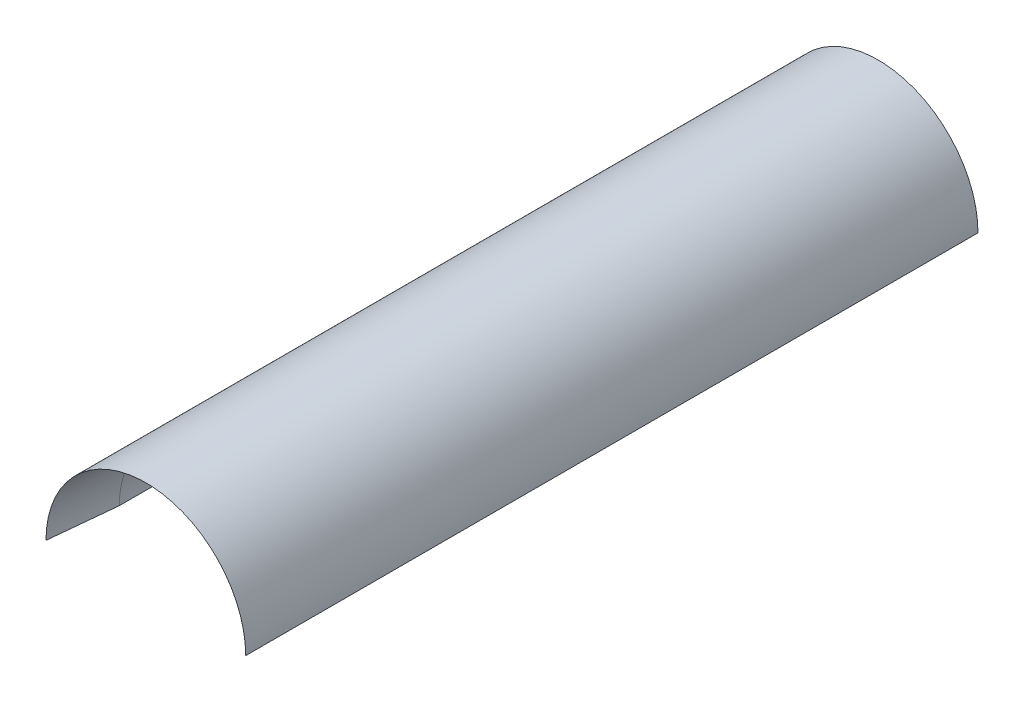
ISO-10303-21;
HEADER;
FILE_DESCRIPTION(('STEP AP214'),'2;1');
FILE_NAME('part.step','',(''),(''),'','','');
FILE_SCHEMA(('AUTOMOTIVE_DESIGN { 1 0 10303 214 1 1 1 1 }'));
ENDSEC;
DATA;
#1=APPLICATION_CONTEXT('core data for automotive mechanical design processes');
#2=APPLICATION_PROTOCOL_DEFINITION('international standard','automotive_design',2000,#1);
#3=PRODUCT_CONTEXT('',#1,'mechanical');
#4=PRODUCT('Part','Part','',(#3));
#5=PRODUCT_RELATED_PRODUCT_CATEGORY('part','',(#4));
#6=PRODUCT_DEFINITION_FORMATION('','',#4);
#7=PRODUCT_DEFINITION_CONTEXT('part definition',#1,'design');
#8=PRODUCT_DEFINITION('design','',#6,#7);
#9=PRODUCT_DEFINITION_SHAPE('','',#8);
#10=(LENGTH_UNIT() NAMED_UNIT(*) SI_UNIT(.MILLI.,.METRE.));
#11=(NAMED_UNIT(*) PLANE_ANGLE_UNIT() SI_UNIT($,.RADIAN.));
#12=(NAMED_UNIT(*) SI_UNIT($,.STERADIAN.) SOLID_ANGLE_UNIT());
#13=UNCERTAINTY_MEASURE_WITH_UNIT(LENGTH_MEASURE(1.E-05),#10,'distance_accuracy_value','');
#14=(GEOMETRIC_REPRESENTATION_CONTEXT(3) GLOBAL_UNCERTAINTY_ASSIGNED_CONTEXT((#13)) GLOBAL_UNIT_ASSIGNED_CONTEXT((#10,
#11,#12)) REPRESENTATION_CONTEXT('',''));
#15=CARTESIAN_POINT('',(0.,0.,0.));
#16=DIRECTION('',(0.,0.,1.));
#17=DIRECTION('',(1.,0.,0.));
#18=AXIS2_PLACEMENT_3D('',#15,#16,#17);
#19=CARTESIAN_POINT('',(0.,0.,220.));
#20=DIRECTION('',(0.,0.,-1.));
#21=DIRECTION('',(-1.,0.,0.));
#22=AXIS2_PLACEMENT_3D('',#19,#20,#21);
#23=CYLINDRICAL_SURFACE('',#22,28.);
#24=DIRECTION('',(0.,0.,-1.));
#25=VECTOR('',#24,1.);
#26=CARTESIAN_POINT('',(28.,0.,220.));
#27=LINE('',#26,#25);
#28=CARTESIAN_POINT('',(28.,0.,199.999999999999));
#29=VERTEX_POINT('',#28);
#30=CARTESIAN_POINT('',(28.,0.,0.));
#31=VERTEX_POINT('',#30);
#32=EDGE_CURVE('E78',#29,#31,#27,.T.);
#33=ORIENTED_EDGE('',*,*,#32,.F.);
#34=CARTESIAN_POINT('',(0.,0.,199.999999999999));
#35=DIRECTION('',(0.,0.,1.));
#36=DIRECTION('',(1.,0.,0.));
#37=AXIS2_PLACEMENT_3D('',#34,#35,#36);
#38=CIRCLE('',#37,28.);
#39=CARTESIAN_POINT('',(-28.,0.,199.999999999999));
#40=VERTEX_POINT('',#39);
#41=EDGE_CURVE('E88',#29,#40,#38,.T.);
#42=ORIENTED_EDGE('',*,*,#41,.T.);
#43=DIRECTION('',(0.,0.,-1.));
#44=VECTOR('',#43,1.);
#45=CARTESIAN_POINT('',(-28.,0.,220.));
#46=LINE('',#45,#44);
#47=CARTESIAN_POINT('',(-28.,0.,0.));
#48=VERTEX_POINT('',#47);
#49=EDGE_CURVE('E85',#40,#48,#46,.T.);
#50=ORIENTED_EDGE('',*,*,#49,.T.);
#51=CARTESIAN_POINT('',(0.,0.,0.));
#52=DIRECTION('',(0.,0.,1.));
#53=DIRECTION('',(1.,0.,0.));
#54=AXIS2_PLACEMENT_3D('',#51,#52,#53);
#55=CIRCLE('',#54,28.);
#56=EDGE_CURVE('E101',#31,#48,#55,.T.);
#57=ORIENTED_EDGE('',*,*,#56,.F.);
#58=EDGE_LOOP('',(#33,#42,#50,#57));
#59=FACE_BOUND('',#58,.T.);
#60=ADVANCED_FACE('F34',(#59),#23,.F.);
#61=CARTESIAN_POINT('',(0.,0.,220.));
#62=DIRECTION('',(0.,-1.,0.));
#63=DIRECTION('',(1.,0.,0.));
#64=AXIS2_PLACEMENT_3D('',#61,#62,#63);
#65=PLANE('',#64);
#66=DIRECTION('',(0.,0.,-1.));
#67=VECTOR('',#66,1.);
#68=CARTESIAN_POINT('',(30.,0.,220.));
#69=LINE('',#68,#67);
#70=CARTESIAN_POINT('',(30.,0.,220.));
#71=VERTEX_POINT('',#70);
#72=CARTESIAN_POINT('',(30.,0.,0.));
#73=VERTEX_POINT('',#72);
#74=EDGE_CURVE('E71',#71,#73,#69,.T.);
#75=ORIENTED_EDGE('',*,*,#74,.F.);
#76=DIRECTION('',(0.0995037190209955,0.,0.995037190209989));
#77=VECTOR('',#76,1.);
#78=CARTESIAN_POINT('',(0.,0.,-80.000000000011));
#79=LINE('',#78,#77);
#80=EDGE_CURVE('E11',#71,#29,#79,.F.);
#81=ORIENTED_EDGE('',*,*,#80,.T.);
#82=ORIENTED_EDGE('',*,*,#32,.T.);
#83=DIRECTION('',(-1.,0.,0.));
#84=VECTOR('',#83,1.);
#85=CARTESIAN_POINT('',(0.,0.,0.));
#86=LINE('',#85,#84);
#87=EDGE_CURVE('E75',#73,#31,#86,.T.);
#88=ORIENTED_EDGE('',*,*,#87,.F.);
#89=EDGE_LOOP('',(#75,#81,#82,#88));
#90=FACE_BOUND('',#89,.T.);
#91=ADVANCED_FACE('F73',(#90),#65,.T.);
#92=CARTESIAN_POINT('',(0.,0.,220.));
#93=DIRECTION('',(0.,0.,-1.));
#94=DIRECTION('',(-1.,0.,0.));
#95=AXIS2_PLACEMENT_3D('',#92,#93,#94);
#96=CYLINDRICAL_SURFACE('',#95,30.);
#97=CARTESIAN_POINT('',(0.,0.,0.));
#98=DIRECTION('',(0.,0.,1.));
#99=DIRECTION('',(1.,0.,0.));
#100=AXIS2_PLACEMENT_3D('',#97,#98,#99);
#101=CIRCLE('',#100,30.);
#102=CARTESIAN_POINT('',(-30.,0.,0.));
#103=VERTEX_POINT('',#102);
#104=EDGE_CURVE('E98',#73,#103,#101,.T.);
#105=ORIENTED_EDGE('',*,*,#104,.T.);
#106=DIRECTION('',(0.,0.,-1.));
#107=VECTOR('',#106,1.);
#108=CARTESIAN_POINT('',(-30.,0.,220.));
#109=LINE('',#108,#107);
#110=CARTESIAN_POINT('',(-30.,0.,220.));
#111=VERTEX_POINT('',#110);
#112=EDGE_CURVE('E79',#111,#103,#109,.T.);
#113=ORIENTED_EDGE('',*,*,#112,.F.);
#114=CARTESIAN_POINT('',(0.,0.,220.));
#115=DIRECTION('',(0.,0.,1.));
#116=DIRECTION('',(1.,0.,0.));
#117=AXIS2_PLACEMENT_3D('',#114,#115,#116);
#118=CIRCLE('',#117,30.);
#119=EDGE_CURVE('E82',#71,#111,#118,.T.);
#120=ORIENTED_EDGE('',*,*,#119,.F.);
#121=ORIENTED_EDGE('',*,*,#74,.T.);
#122=EDGE_LOOP('',(#105,#113,#120,#121));
#123=FACE_BOUND('',#122,.T.);
#124=ADVANCED_FACE('F83',(#123),#96,.T.);
#125=CARTESIAN_POINT('',(0.,0.,220.));
#126=DIRECTION('',(0.,1.,0.));
#127=DIRECTION('',(0.,0.,1.));
#128=AXIS2_PLACEMENT_3D('',#125,#126,#127);
#129=PLANE('',#128);
#130=ORIENTED_EDGE('',*,*,#49,.F.);
#131=DIRECTION('',(-0.0995037190209955,0.,0.995037190209989));
#132=VECTOR('',#131,1.);
#133=CARTESIAN_POINT('',(0.,0.,-80.000000000011));
#134=LINE('',#133,#132);
#135=EDGE_CURVE('E42',#40,#111,#134,.T.);
#136=ORIENTED_EDGE('',*,*,#135,.T.);
#137=ORIENTED_EDGE('',*,*,#112,.T.);
#138=DIRECTION('',(1.,0.,0.));
#139=VECTOR('',#138,1.);
#140=CARTESIAN_POINT('',(0.,0.,0.));
#141=LINE('',#140,#139);
#142=EDGE_CURVE('E86',#103,#48,#141,.T.);
#143=ORIENTED_EDGE('',*,*,#142,.T.);
#144=EDGE_LOOP('',(#130,#136,#137,#143));
#145=FACE_BOUND('',#144,.T.);
#146=ADVANCED_FACE('F108',(#145),#129,.F.);
#147=CARTESIAN_POINT('',(0.,0.,0.));
#148=DIRECTION('',(0.,0.,1.));
#149=DIRECTION('',(1.,0.,0.));
#150=AXIS2_PLACEMENT_3D('',#147,#148,#149);
#151=PLANE('',#150);
#152=ORIENTED_EDGE('',*,*,#56,.T.);
#153=ORIENTED_EDGE('',*,*,#142,.F.);
#154=ORIENTED_EDGE('',*,*,#104,.F.);
#155=ORIENTED_EDGE('',*,*,#87,.T.);
#156=EDGE_LOOP('',(#152,#153,#154,#155));
#157=FACE_BOUND('',#156,.T.);
#158=ADVANCED_FACE('F106',(#157),#151,.F.);
#159=CARTESIAN_POINT('',(0.,0.,199.999999999999));
#160=DIRECTION('',(0.,0.,1.));
#161=DIRECTION('',(1.,0.,0.));
#162=AXIS2_PLACEMENT_3D('',#159,#160,#161);
#163=CONICAL_SURFACE('',#162,28.,0.0996686524911586);
#164=ORIENTED_EDGE('',*,*,#80,.F.);
#165=ORIENTED_EDGE('',*,*,#119,.T.);
#166=ORIENTED_EDGE('',*,*,#135,.F.);
#167=ORIENTED_EDGE('',*,*,#41,.F.);
#168=EDGE_LOOP('',(#164,#165,#166,#167));
#169=FACE_BOUND('',#168,.T.);
#170=ADVANCED_FACE('F36',(#169),#163,.F.);
#171=CLOSED_SHELL('',(#60,#91,#124,#146,#158,#170));
#172=MANIFOLD_SOLID_BREP('B2',#171);
#173=ADVANCED_BREP_SHAPE_REPRESENTATION('',(#18,#172),#14);
#174=SHAPE_DEFINITION_REPRESENTATION(#9,#173);
ENDSEC;
END-ISO-10303-21;
